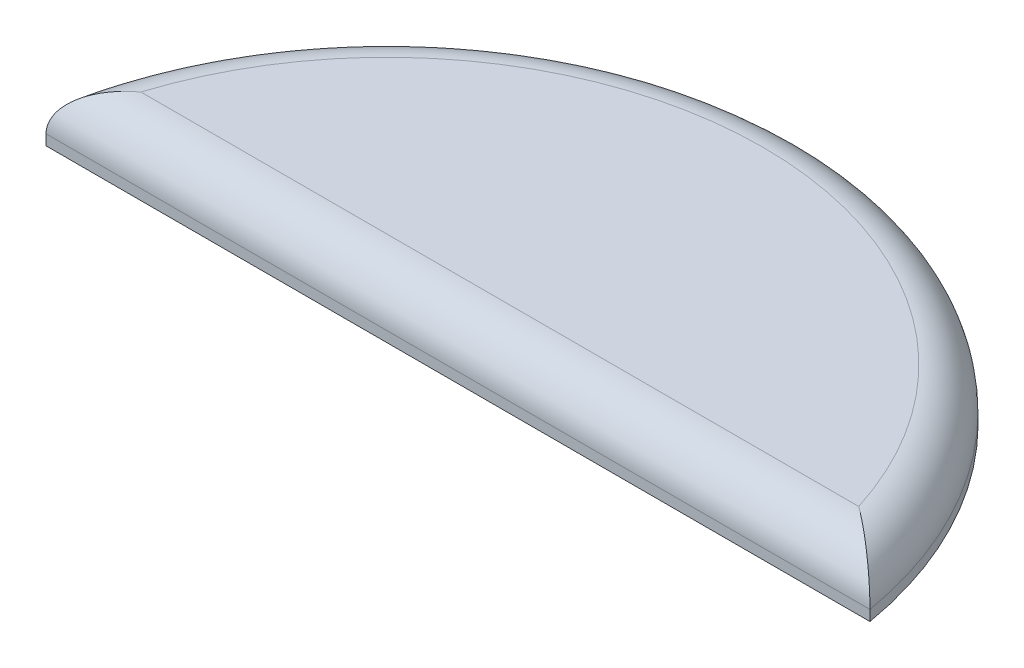
ISO-10303-21;
HEADER;
FILE_DESCRIPTION(('STEP AP214'),'2;1');
FILE_NAME('part.step','',(''),(''),'','','');
FILE_SCHEMA(('AUTOMOTIVE_DESIGN { 1 0 10303 214 1 1 1 1 }'));
ENDSEC;
DATA;
#1=APPLICATION_CONTEXT('core data for automotive mechanical design processes');
#2=APPLICATION_PROTOCOL_DEFINITION('international standard','automotive_design',2000,#1);
#3=PRODUCT_CONTEXT('',#1,'mechanical');
#4=PRODUCT('Part','Part','',(#3));
#5=PRODUCT_RELATED_PRODUCT_CATEGORY('part','',(#4));
#6=PRODUCT_DEFINITION_FORMATION('','',#4);
#7=PRODUCT_DEFINITION_CONTEXT('part definition',#1,'design');
#8=PRODUCT_DEFINITION('design','',#6,#7);
#9=PRODUCT_DEFINITION_SHAPE('','',#8);
#10=(LENGTH_UNIT() NAMED_UNIT(*) SI_UNIT(.MILLI.,.METRE.));
#11=(NAMED_UNIT(*) PLANE_ANGLE_UNIT() SI_UNIT($,.RADIAN.));
#12=(NAMED_UNIT(*) SI_UNIT($,.STERADIAN.) SOLID_ANGLE_UNIT());
#13=UNCERTAINTY_MEASURE_WITH_UNIT(LENGTH_MEASURE(1.E-05),#10,'distance_accuracy_value','');
#14=(GEOMETRIC_REPRESENTATION_CONTEXT(3) GLOBAL_UNCERTAINTY_ASSIGNED_CONTEXT((#13)) GLOBAL_UNIT_ASSIGNED_CONTEXT((#10,
#11,#12)) REPRESENTATION_CONTEXT('',''));
#15=CARTESIAN_POINT('',(0.,0.,0.));
#16=DIRECTION('',(0.,0.,1.));
#17=DIRECTION('',(1.,0.,0.));
#18=AXIS2_PLACEMENT_3D('',#15,#16,#17);
#19=CARTESIAN_POINT('',(-2.57054347826088,5.,6.81599405809601));
#20=DIRECTION('',(0.,-1.,0.));
#21=DIRECTION('',(0.,0.,-1.));
#22=AXIS2_PLACEMENT_3D('',#19,#20,#21);
#23=CYLINDRICAL_SURFACE('',#22,40.);
#24=DIRECTION('',(0.,-1.,0.));
#25=VECTOR('',#24,1.);
#26=CARTESIAN_POINT('',(-41.9855434782609,5.,0.));
#27=LINE('',#26,#25);
#28=CARTESIAN_POINT('',(-41.9855434782609,1.,0.));
#29=VERTEX_POINT('',#28);
#30=CARTESIAN_POINT('',(-41.9855434782609,0.,0.));
#31=VERTEX_POINT('',#30);
#32=EDGE_CURVE('E81',#29,#31,#27,.T.);
#33=ORIENTED_EDGE('',*,*,#32,.F.);
#34=CARTESIAN_POINT('',(-2.57054347826088,1.,6.81599405809601));
#35=DIRECTION('',(0.,-1.,0.));
#36=DIRECTION('',(0.,0.,-1.));
#37=AXIS2_PLACEMENT_3D('',#34,#35,#36);
#38=CIRCLE('',#37,40.);
#39=CARTESIAN_POINT('',(36.8444565217391,1.,0.));
#40=VERTEX_POINT('',#39);
#41=EDGE_CURVE('E11',#29,#40,#38,.T.);
#42=ORIENTED_EDGE('',*,*,#41,.T.);
#43=DIRECTION('',(0.,-1.,0.));
#44=VECTOR('',#43,1.);
#45=CARTESIAN_POINT('',(36.8444565217391,5.,0.));
#46=LINE('',#45,#44);
#47=CARTESIAN_POINT('',(36.8444565217391,0.,0.));
#48=VERTEX_POINT('',#47);
#49=EDGE_CURVE('E89',#40,#48,#46,.T.);
#50=ORIENTED_EDGE('',*,*,#49,.T.);
#51=CARTESIAN_POINT('',(-2.57054347826088,0.,6.81599405809601));
#52=DIRECTION('',(0.,1.,0.));
#53=DIRECTION('',(0.,0.,-1.));
#54=AXIS2_PLACEMENT_3D('',#51,#52,#53);
#55=CIRCLE('',#54,40.);
#56=EDGE_CURVE('E93',#48,#31,#55,.T.);
#57=ORIENTED_EDGE('',*,*,#56,.T.);
#58=EDGE_LOOP('',(#33,#42,#50,#57));
#59=FACE_BOUND('',#58,.T.);
#60=ADVANCED_FACE('F39',(#59),#23,.T.);
#61=CARTESIAN_POINT('',(-41.9855434782609,5.,0.));
#62=DIRECTION('',(0.,0.,-1.));
#63=DIRECTION('',(-1.,0.,0.));
#64=AXIS2_PLACEMENT_3D('',#61,#62,#63);
#65=PLANE('',#64);
#66=ORIENTED_EDGE('',*,*,#49,.F.);
#67=DIRECTION('',(1.,0.,0.));
#68=VECTOR('',#67,1.);
#69=CARTESIAN_POINT('',(-41.9855434782609,1.,0.));
#70=LINE('',#69,#68);
#71=EDGE_CURVE('E54',#40,#29,#70,.F.);
#72=ORIENTED_EDGE('',*,*,#71,.T.);
#73=ORIENTED_EDGE('',*,*,#32,.T.);
#74=DIRECTION('',(1.,0.,0.));
#75=VECTOR('',#74,1.);
#76=CARTESIAN_POINT('',(-41.9855434782609,0.,0.));
#77=LINE('',#76,#75);
#78=EDGE_CURVE('E84',#31,#48,#77,.T.);
#79=ORIENTED_EDGE('',*,*,#78,.T.);
#80=EDGE_LOOP('',(#66,#72,#73,#79));
#81=FACE_BOUND('',#80,.T.);
#82=ADVANCED_FACE('F83',(#81),#65,.F.);
#83=CARTESIAN_POINT('',(-2.57054347826088,5.,6.81599405809601));
#84=DIRECTION('',(0.,-1.,0.));
#85=DIRECTION('',(0.,0.,-1.));
#86=AXIS2_PLACEMENT_3D('',#83,#84,#85);
#87=PLANE('',#86);
#88=CARTESIAN_POINT('',(-2.57054347826088,5.,6.81599405809601));
#89=DIRECTION('',(0.,-1.,0.));
#90=DIRECTION('',(0.,0.,-1.));
#91=AXIS2_PLACEMENT_3D('',#88,#89,#90);
#92=CIRCLE('',#91,36.);
#93=CARTESIAN_POINT('',(31.7662337807544,5.,-4.));
#94=VERTEX_POINT('',#93);
#95=CARTESIAN_POINT('',(-36.9073207372762,5.,-4.));
#96=VERTEX_POINT('',#95);
#97=EDGE_CURVE('E88',#94,#96,#92,.F.);
#98=ORIENTED_EDGE('',*,*,#97,.T.);
#99=DIRECTION('',(1.,0.,0.));
#100=VECTOR('',#99,1.);
#101=CARTESIAN_POINT('',(-2.57054347826088,5.,-4.));
#102=LINE('',#101,#100);
#103=EDGE_CURVE('E105',#96,#94,#102,.T.);
#104=ORIENTED_EDGE('',*,*,#103,.T.);
#105=EDGE_LOOP('',(#98,#104));
#106=FACE_BOUND('',#105,.T.);
#107=ADVANCED_FACE('F124',(#106),#87,.F.);
#108=CARTESIAN_POINT('',(-2.57054347826088,0.,6.81599405809601));
#109=DIRECTION('',(0.,-1.,0.));
#110=DIRECTION('',(0.,0.,-1.));
#111=AXIS2_PLACEMENT_3D('',#108,#109,#110);
#112=PLANE('',#111);
#113=ORIENTED_EDGE('',*,*,#56,.F.);
#114=ORIENTED_EDGE('',*,*,#78,.F.);
#115=EDGE_LOOP('',(#113,#114));
#116=FACE_BOUND('',#115,.T.);
#117=ADVANCED_FACE('F92',(#116),#112,.T.);
#118=CARTESIAN_POINT('',(-2.57054347826088,1.,6.81599405809601));
#119=DIRECTION('',(0.,-1.,0.));
#120=DIRECTION('',(0.,0.,-1.));
#121=AXIS2_PLACEMENT_3D('',#118,#119,#120);
#122=TOROIDAL_SURFACE('',#121,36.,4.);
#123=CARTESIAN_POINT('',(36.8444565217391,1.,0.));
#124=CARTESIAN_POINT('',(36.8444830293171,1.08475010589167,2.36415171837349E-05));
#125=CARTESIAN_POINT('',(36.8412582800003,1.16948020262322,-0.00269261623891686));
#126=CARTESIAN_POINT('',(36.8285112600787,1.33804690635998,-0.0134225937985847));
#127=CARTESIAN_POINT('',(36.8189951383998,1.42188430463848,-0.0214311411347355));
#128=CARTESIAN_POINT('',(36.7939957385254,1.58714694822723,-0.0424579477333388));
#129=CARTESIAN_POINT('',(36.7785733160365,1.66858795897781,-0.0554251137877781));
#130=CARTESIAN_POINT('',(36.7421164145498,1.82928942164966,-0.0860531832001073));
#131=CARTESIAN_POINT('',(36.7210809093058,1.90854947189732,-0.103714944873952));
#132=CARTESIAN_POINT('',(36.6503422683859,2.14165603264078,-0.163048606934935));
#133=CARTESIAN_POINT('',(36.5928848408784,2.2915984640201,-0.211172009514959));
#134=CARTESIAN_POINT('',(36.4609253194022,2.57844579810971,-0.321375503879006));
#135=CARTESIAN_POINT('',(36.3863775296025,2.71531432854417,-0.38349300492043));
#136=CARTESIAN_POINT('',(36.1853183576726,3.03643320125301,-0.550449000139266));
#137=CARTESIAN_POINT('',(36.0509117496704,3.21245135248072,-0.661592671882452));
#138=CARTESIAN_POINT('',(35.7617781107299,3.5348579982125,-0.899226123848696));
#139=CARTESIAN_POINT('',(35.607009717056,3.68118459651526,-1.02574710041349));
#140=CARTESIAN_POINT('',(35.3216297222364,3.91529022894619,-1.25748457162598));
#141=CARTESIAN_POINT('',(35.193932273554,4.00873771889621,-1.36068600236618));
#142=CARTESIAN_POINT('',(34.9321168354235,4.18106891666421,-1.57114925798632));
#143=CARTESIAN_POINT('',(34.7979953930445,4.25994467892326,-1.6784132598893));
#144=CARTESIAN_POINT('',(34.5246465539814,4.40432119871517,-1.89580315542954));
#145=CARTESIAN_POINT('',(34.3854119640571,4.46980219006347,-2.00593301199688));
#146=CARTESIAN_POINT('',(34.103128993441,4.58824869533888,-2.22791275585541));
#147=CARTESIAN_POINT('',(33.9600812127673,4.6412161655234,-2.33976237137835));
#148=CARTESIAN_POINT('',(33.6509270007976,4.74205375103383,-2.58004101337487));
#149=CARTESIAN_POINT('',(33.4843732554907,4.78819906819767,-2.70861873470489));
#150=CARTESIAN_POINT('',(33.1483582820327,4.86644012927562,-2.96619336854031));
#151=CARTESIAN_POINT('',(32.9788964370734,4.89853285338389,-3.09519036515108));
#152=CARTESIAN_POINT('',(32.4679080950003,4.97489712003378,-3.48133854465002));
#153=CARTESIAN_POINT('',(32.1229711399706,4.99950697589689,-3.73827545096076));
#154=CARTESIAN_POINT('',(31.7731961408173,4.99999754630919,-3.99489313294471));
#155=CARTESIAN_POINT('',(31.769715027724,4.99999999087625,-3.99744671294113));
#156=CARTESIAN_POINT('',(31.7662337807544,5.,-4.));
#157=B_SPLINE_CURVE_WITH_KNOTS('',3,(#123,#124,#125,#126,#127,#128,#129,#130,#131,#132,#133,
#134,#135,#136,#137,#138,#139,#140,#141,#142,#143,#144,#145,#146,#147,#148,#149,#150,#151,#152,
#153,#154,#155,#156),.UNSPECIFIED.,.F.,.F.,(4,2,2,2,2,2,2,2,2,2,2,2,2,2,2,2,4),(0.,
0.254113107954493,0.507978222743798,0.759295100054491,1.0106579574352,1.5110588510647,
2.01281364087737,2.75203485281954,3.49278159174097,4.05878522160699,4.62509657246405,
5.1922376742332,5.7592900552318,6.40495887965064,7.05076638585835,8.33923996550928,
8.35219180778049),.UNSPECIFIED.);
#158=EDGE_CURVE('E99',#40,#94,#157,.T.);
#159=ORIENTED_EDGE('',*,*,#158,.F.);
#160=ORIENTED_EDGE('',*,*,#41,.F.);
#161=CARTESIAN_POINT('',(-41.9855434782609,1.,0.));
#162=CARTESIAN_POINT('',(-41.9855699858388,1.08475010589167,2.36415171830191E-05));
#163=CARTESIAN_POINT('',(-41.9823452365221,1.16948020262322,-0.00269261623891737));
#164=CARTESIAN_POINT('',(-41.9695982166004,1.33804690635998,-0.0134225937985848));
#165=CARTESIAN_POINT('',(-41.9600820949215,1.42188430463848,-0.0214311411347354));
#166=CARTESIAN_POINT('',(-41.9350826950471,1.58714694822723,-0.0424579477333391));
#167=CARTESIAN_POINT('',(-41.9196602725582,1.66858795897781,-0.0554251137877789));
#168=CARTESIAN_POINT('',(-41.8832033710716,1.82928942164966,-0.086053183200108));
#169=CARTESIAN_POINT('',(-41.8621678658275,1.90854947189732,-0.103714944873952));
#170=CARTESIAN_POINT('',(-41.7914292249076,2.14165603264078,-0.163048606934934));
#171=CARTESIAN_POINT('',(-41.7339717974001,2.2915984640201,-0.211172009514959));
#172=CARTESIAN_POINT('',(-41.602012275924,2.57844579810971,-0.321375503879006));
#173=CARTESIAN_POINT('',(-41.5274644861243,2.71531432854417,-0.38349300492043));
#174=CARTESIAN_POINT('',(-41.3264053141943,3.036433201253,-0.550449000139265));
#175=CARTESIAN_POINT('',(-41.1919987061922,3.21245135248071,-0.661592671882449));
#176=CARTESIAN_POINT('',(-40.9028650672517,3.5348579982125,-0.899226123848694));
#177=CARTESIAN_POINT('',(-40.7480966735777,3.68118459651526,-1.02574710041349));
#178=CARTESIAN_POINT('',(-40.4627166787582,3.91529022894619,-1.25748457162597));
#179=CARTESIAN_POINT('',(-40.3350192300758,4.0087377188962,-1.36068600236617));
#180=CARTESIAN_POINT('',(-40.0732037919453,4.18106891666421,-1.57114925798631));
#181=CARTESIAN_POINT('',(-39.9390823495662,4.25994467892326,-1.6784132598893));
#182=CARTESIAN_POINT('',(-39.6657335105031,4.40432119871516,-1.89580315542953));
#183=CARTESIAN_POINT('',(-39.5264989205788,4.46980219006346,-2.00593301199687));
#184=CARTESIAN_POINT('',(-39.2442159499628,4.58824869533887,-2.2279127558554));
#185=CARTESIAN_POINT('',(-39.1011681692891,4.6412161655234,-2.33976237137834));
#186=CARTESIAN_POINT('',(-38.7920139573194,4.74205375103383,-2.58004101337487));
#187=CARTESIAN_POINT('',(-38.6254602120125,4.78819906819766,-2.70861873470489));
#188=CARTESIAN_POINT('',(-38.2894452385544,4.86644012927561,-2.9661933685403));
#189=CARTESIAN_POINT('',(-38.1199833935952,4.89853285338389,-3.09519036515107));
#190=CARTESIAN_POINT('',(-37.6089950515221,4.97489712003378,-3.48133854465001));
#191=CARTESIAN_POINT('',(-37.2640580964923,4.99950697589689,-3.73827545096076));
#192=CARTESIAN_POINT('',(-36.914283097339,4.99999754630919,-3.99489313294471));
#193=CARTESIAN_POINT('',(-36.9108019842457,4.99999999087625,-3.99744671294113));
#194=CARTESIAN_POINT('',(-36.9073207372762,5.,-4.));
#195=B_SPLINE_CURVE_WITH_KNOTS('',3,(#161,#162,#163,#164,#165,#166,#167,#168,#169,#170,#171,
#172,#173,#174,#175,#176,#177,#178,#179,#180,#181,#182,#183,#184,#185,#186,#187,#188,#189,#190,
#191,#192,#193,#194),.UNSPECIFIED.,.F.,.F.,(4,2,2,2,2,2,2,2,2,2,2,2,2,2,2,2,4),(0.,
0.254113107954492,0.507978222743798,0.75929510005449,1.0106579574352,1.5110588510647,
2.01281364087737,2.75203485281953,3.49278159174097,4.05878522160697,4.62509657246404,
5.19223767423319,5.7592900552318,6.40495887965063,7.05076638585834,8.33923996550928,
8.35219180778049),.UNSPECIFIED.);
#196=EDGE_CURVE('E44',#96,#29,#195,.F.);
#197=ORIENTED_EDGE('',*,*,#196,.F.);
#198=ORIENTED_EDGE('',*,*,#97,.F.);
#199=EDGE_LOOP('',(#159,#160,#197,#198));
#200=FACE_BOUND('',#199,.T.);
#201=ADVANCED_FACE('F41',(#200),#122,.T.);
#202=CARTESIAN_POINT('',(-2.57054347826088,1.,-4.));
#203=DIRECTION('',(1.,0.,0.));
#204=DIRECTION('',(0.,0.,-1.));
#205=AXIS2_PLACEMENT_3D('',#202,#203,#204);
#206=CYLINDRICAL_SURFACE('',#205,4.);
#207=ORIENTED_EDGE('',*,*,#196,.T.);
#208=ORIENTED_EDGE('',*,*,#71,.F.);
#209=ORIENTED_EDGE('',*,*,#158,.T.);
#210=ORIENTED_EDGE('',*,*,#103,.F.);
#211=EDGE_LOOP('',(#207,#208,#209,#210));
#212=FACE_BOUND('',#211,.T.);
#213=ADVANCED_FACE('F115',(#212),#206,.T.);
#214=CLOSED_SHELL('',(#60,#82,#107,#117,#201,#213));
#215=MANIFOLD_SOLID_BREP('B2',#214);
#216=ADVANCED_BREP_SHAPE_REPRESENTATION('',(#18,#215),#14);
#217=SHAPE_DEFINITION_REPRESENTATION(#9,#216);
ENDSEC;
END-ISO-10303-21;
